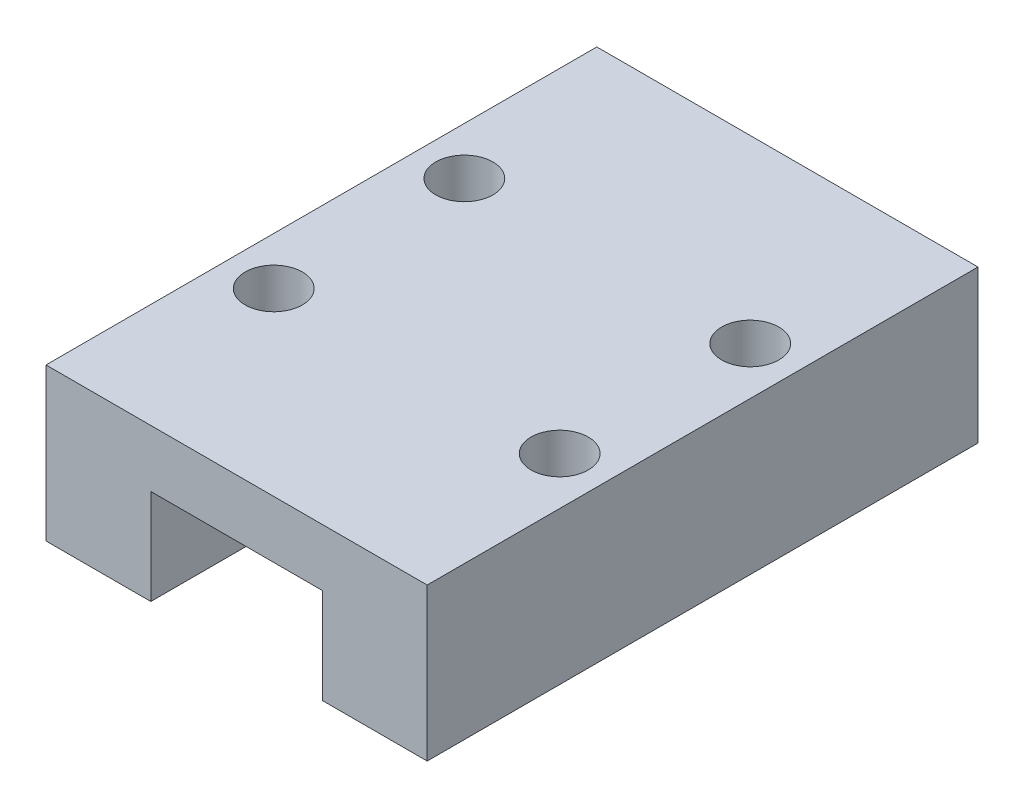
ISO-10303-21;
HEADER;
FILE_DESCRIPTION(('STEP AP214'),'2;1');
FILE_NAME('part.step','',(''),(''),'','','');
FILE_SCHEMA(('AUTOMOTIVE_DESIGN { 1 0 10303 214 1 1 1 1 }'));
ENDSEC;
DATA;
#1=APPLICATION_CONTEXT('core data for automotive mechanical design processes');
#2=APPLICATION_PROTOCOL_DEFINITION('international standard','automotive_design',2000,#1);
#3=PRODUCT_CONTEXT('',#1,'mechanical');
#4=PRODUCT('Part','Part','',(#3));
#5=PRODUCT_RELATED_PRODUCT_CATEGORY('part','',(#4));
#6=PRODUCT_DEFINITION_FORMATION('','',#4);
#7=PRODUCT_DEFINITION_CONTEXT('part definition',#1,'design');
#8=PRODUCT_DEFINITION('design','',#6,#7);
#9=PRODUCT_DEFINITION_SHAPE('','',#8);
#10=(LENGTH_UNIT() NAMED_UNIT(*) SI_UNIT(.MILLI.,.METRE.));
#11=(NAMED_UNIT(*) PLANE_ANGLE_UNIT() SI_UNIT($,.RADIAN.));
#12=(NAMED_UNIT(*) SI_UNIT($,.STERADIAN.) SOLID_ANGLE_UNIT());
#13=UNCERTAINTY_MEASURE_WITH_UNIT(LENGTH_MEASURE(1.E-05),#10,'distance_accuracy_value','');
#14=(GEOMETRIC_REPRESENTATION_CONTEXT(3) GLOBAL_UNCERTAINTY_ASSIGNED_CONTEXT((#13)) GLOBAL_UNIT_ASSIGNED_CONTEXT((#10,
#11,#12)) REPRESENTATION_CONTEXT('',''));
#15=CARTESIAN_POINT('',(0.,0.,0.));
#16=DIRECTION('',(0.,0.,1.));
#17=DIRECTION('',(1.,0.,0.));
#18=AXIS2_PLACEMENT_3D('',#15,#16,#17);
#19=CARTESIAN_POINT('',(0.,0.,28.9));
#20=DIRECTION('',(-1.,0.,0.));
#21=DIRECTION('',(0.,-1.,0.));
#22=AXIS2_PLACEMENT_3D('',#19,#20,#21);
#23=PLANE('',#22);
#24=DIRECTION('',(0.,1.,0.));
#25=VECTOR('',#24,1.);
#26=CARTESIAN_POINT('',(0.,0.,0.));
#27=LINE('',#26,#25);
#28=CARTESIAN_POINT('',(0.,0.,0.));
#29=VERTEX_POINT('',#28);
#30=CARTESIAN_POINT('',(0.,8.,0.));
#31=VERTEX_POINT('',#30);
#32=EDGE_CURVE('E130',#29,#31,#27,.T.);
#33=ORIENTED_EDGE('',*,*,#32,.T.);
#34=DIRECTION('',(0.,0.,-1.));
#35=VECTOR('',#34,1.);
#36=CARTESIAN_POINT('',(0.,8.,28.9));
#37=LINE('',#36,#35);
#38=CARTESIAN_POINT('',(0.,8.,28.9));
#39=VERTEX_POINT('',#38);
#40=EDGE_CURVE('E11',#39,#31,#37,.T.);
#41=ORIENTED_EDGE('',*,*,#40,.F.);
#42=DIRECTION('',(0.,1.,0.));
#43=VECTOR('',#42,1.);
#44=CARTESIAN_POINT('',(0.,0.,28.9));
#45=LINE('',#44,#43);
#46=CARTESIAN_POINT('',(0.,0.,28.9));
#47=VERTEX_POINT('',#46);
#48=EDGE_CURVE('E145',#47,#39,#45,.T.);
#49=ORIENTED_EDGE('',*,*,#48,.F.);
#50=DIRECTION('',(0.,0.,-1.));
#51=VECTOR('',#50,1.);
#52=CARTESIAN_POINT('',(0.,0.,28.9));
#53=LINE('',#52,#51);
#54=EDGE_CURVE('E126',#47,#29,#53,.T.);
#55=ORIENTED_EDGE('',*,*,#54,.T.);
#56=EDGE_LOOP('',(#33,#41,#49,#55));
#57=FACE_BOUND('',#56,.T.);
#58=ADVANCED_FACE('F34',(#57),#23,.F.);
#59=CARTESIAN_POINT('',(0.,8.,28.9));
#60=DIRECTION('',(0.,-1.,0.));
#61=DIRECTION('',(1.,0.,0.));
#62=AXIS2_PLACEMENT_3D('',#59,#60,#61);
#63=PLANE('',#62);
#64=CARTESIAN_POINT('',(-17.5,8.,19.45));
#65=DIRECTION('',(0.,1.,0.));
#66=DIRECTION('',(1.,0.,0.));
#67=AXIS2_PLACEMENT_3D('',#64,#65,#66);
#68=CIRCLE('',#67,1.5);
#69=CARTESIAN_POINT('',(-16.,8.,19.45));
#70=VERTEX_POINT('',#69);
#71=EDGE_CURVE('E196',#70,#70,#68,.T.);
#72=ORIENTED_EDGE('',*,*,#71,.F.);
#73=EDGE_LOOP('',(#72));
#74=FACE_BOUND('',#73,.T.);
#75=CARTESIAN_POINT('',(-2.5,8.,19.45));
#76=DIRECTION('',(0.,1.,0.));
#77=DIRECTION('',(-1.,0.,0.));
#78=AXIS2_PLACEMENT_3D('',#75,#76,#77);
#79=CIRCLE('',#78,1.5);
#80=CARTESIAN_POINT('',(-4.,8.,19.45));
#81=VERTEX_POINT('',#80);
#82=EDGE_CURVE('E190',#81,#81,#79,.T.);
#83=ORIENTED_EDGE('',*,*,#82,.F.);
#84=EDGE_LOOP('',(#83));
#85=FACE_BOUND('',#84,.T.);
#86=CARTESIAN_POINT('',(-2.5,8.,9.45));
#87=DIRECTION('',(0.,1.,0.));
#88=DIRECTION('',(1.,0.,0.));
#89=AXIS2_PLACEMENT_3D('',#86,#87,#88);
#90=CIRCLE('',#89,1.5);
#91=CARTESIAN_POINT('',(-1.,8.,9.45));
#92=VERTEX_POINT('',#91);
#93=EDGE_CURVE('E184',#92,#92,#90,.T.);
#94=ORIENTED_EDGE('',*,*,#93,.F.);
#95=EDGE_LOOP('',(#94));
#96=FACE_BOUND('',#95,.T.);
#97=CARTESIAN_POINT('',(-17.5,8.,9.45));
#98=DIRECTION('',(0.,1.,0.));
#99=DIRECTION('',(-1.,0.,0.));
#100=AXIS2_PLACEMENT_3D('',#97,#98,#99);
#101=CIRCLE('',#100,1.5);
#102=CARTESIAN_POINT('',(-19.,8.,9.45));
#103=VERTEX_POINT('',#102);
#104=EDGE_CURVE('E178',#103,#103,#101,.T.);
#105=ORIENTED_EDGE('',*,*,#104,.F.);
#106=EDGE_LOOP('',(#105));
#107=FACE_BOUND('',#106,.T.);
#108=DIRECTION('',(-1.,0.,0.));
#109=VECTOR('',#108,1.);
#110=CARTESIAN_POINT('',(0.,8.,0.));
#111=LINE('',#110,#109);
#112=CARTESIAN_POINT('',(-20.,8.,0.));
#113=VERTEX_POINT('',#112);
#114=EDGE_CURVE('E133',#31,#113,#111,.T.);
#115=ORIENTED_EDGE('',*,*,#114,.T.);
#116=DIRECTION('',(0.,0.,-1.));
#117=VECTOR('',#116,1.);
#118=CARTESIAN_POINT('',(-20.,8.,28.9));
#119=LINE('',#118,#117);
#120=CARTESIAN_POINT('',(-20.,8.,28.9));
#121=VERTEX_POINT('',#120);
#122=EDGE_CURVE('E42',#121,#113,#119,.T.);
#123=ORIENTED_EDGE('',*,*,#122,.F.);
#124=DIRECTION('',(-1.,0.,0.));
#125=VECTOR('',#124,1.);
#126=CARTESIAN_POINT('',(0.,8.,28.9));
#127=LINE('',#126,#125);
#128=EDGE_CURVE('E93',#39,#121,#127,.T.);
#129=ORIENTED_EDGE('',*,*,#128,.F.);
#130=ORIENTED_EDGE('',*,*,#40,.T.);
#131=EDGE_LOOP('',(#115,#123,#129,#130));
#132=FACE_BOUND('',#131,.T.);
#133=ADVANCED_FACE('F211',(#74,#85,#96,#107,#132),#63,.F.);
#134=CARTESIAN_POINT('',(-20.,0.,28.9));
#135=DIRECTION('',(1.,0.,0.));
#136=DIRECTION('',(0.,0.,-1.));
#137=AXIS2_PLACEMENT_3D('',#134,#135,#136);
#138=PLANE('',#137);
#139=DIRECTION('',(0.,-1.,0.));
#140=VECTOR('',#139,1.);
#141=CARTESIAN_POINT('',(-20.,0.,0.));
#142=LINE('',#141,#140);
#143=CARTESIAN_POINT('',(-20.,0.,0.));
#144=VERTEX_POINT('',#143);
#145=EDGE_CURVE('E136',#113,#144,#142,.T.);
#146=ORIENTED_EDGE('',*,*,#145,.T.);
#147=DIRECTION('',(0.,0.,-1.));
#148=VECTOR('',#147,1.);
#149=CARTESIAN_POINT('',(-20.,0.,28.9));
#150=LINE('',#149,#148);
#151=CARTESIAN_POINT('',(-20.,0.,28.9));
#152=VERTEX_POINT('',#151);
#153=EDGE_CURVE('E152',#152,#144,#150,.T.);
#154=ORIENTED_EDGE('',*,*,#153,.F.);
#155=DIRECTION('',(0.,-1.,0.));
#156=VECTOR('',#155,1.);
#157=CARTESIAN_POINT('',(-20.,0.,28.9));
#158=LINE('',#157,#156);
#159=EDGE_CURVE('E160',#121,#152,#158,.T.);
#160=ORIENTED_EDGE('',*,*,#159,.F.);
#161=ORIENTED_EDGE('',*,*,#122,.T.);
#162=EDGE_LOOP('',(#146,#154,#160,#161));
#163=FACE_BOUND('',#162,.T.);
#164=ADVANCED_FACE('F158',(#163),#138,.F.);
#165=CARTESIAN_POINT('',(-14.5,0.,28.9));
#166=DIRECTION('',(0.,1.,0.));
#167=DIRECTION('',(-1.,0.,0.));
#168=AXIS2_PLACEMENT_3D('',#165,#166,#167);
#169=PLANE('',#168);
#170=DIRECTION('',(1.,0.,0.));
#171=VECTOR('',#170,1.);
#172=CARTESIAN_POINT('',(-14.5,0.,0.));
#173=LINE('',#172,#171);
#174=CARTESIAN_POINT('',(-14.5,0.,0.));
#175=VERTEX_POINT('',#174);
#176=EDGE_CURVE('E138',#144,#175,#173,.T.);
#177=ORIENTED_EDGE('',*,*,#176,.T.);
#178=DIRECTION('',(0.,0.,-1.));
#179=VECTOR('',#178,1.);
#180=CARTESIAN_POINT('',(-14.5,0.,28.9));
#181=LINE('',#180,#179);
#182=CARTESIAN_POINT('',(-14.5,0.,28.9));
#183=VERTEX_POINT('',#182);
#184=EDGE_CURVE('E149',#183,#175,#181,.T.);
#185=ORIENTED_EDGE('',*,*,#184,.F.);
#186=DIRECTION('',(1.,0.,0.));
#187=VECTOR('',#186,1.);
#188=CARTESIAN_POINT('',(-14.5,0.,28.9));
#189=LINE('',#188,#187);
#190=EDGE_CURVE('E172',#152,#183,#189,.T.);
#191=ORIENTED_EDGE('',*,*,#190,.F.);
#192=ORIENTED_EDGE('',*,*,#153,.T.);
#193=EDGE_LOOP('',(#177,#185,#191,#192));
#194=FACE_BOUND('',#193,.T.);
#195=ADVANCED_FACE('F168',(#194),#169,.F.);
#196=CARTESIAN_POINT('',(-14.5,0.,28.9));
#197=DIRECTION('',(-1.,0.,0.));
#198=DIRECTION('',(0.,0.,1.));
#199=AXIS2_PLACEMENT_3D('',#196,#197,#198);
#200=PLANE('',#199);
#201=DIRECTION('',(0.,1.,0.));
#202=VECTOR('',#201,1.);
#203=CARTESIAN_POINT('',(-14.5,0.,0.));
#204=LINE('',#203,#202);
#205=CARTESIAN_POINT('',(-14.5,5.,0.));
#206=VERTEX_POINT('',#205);
#207=EDGE_CURVE('E140',#175,#206,#204,.T.);
#208=ORIENTED_EDGE('',*,*,#207,.T.);
#209=DIRECTION('',(0.,0.,-1.));
#210=VECTOR('',#209,1.);
#211=CARTESIAN_POINT('',(-14.5,5.,28.9));
#212=LINE('',#211,#210);
#213=CARTESIAN_POINT('',(-14.5,5.,28.9));
#214=VERTEX_POINT('',#213);
#215=EDGE_CURVE('E121',#214,#206,#212,.T.);
#216=ORIENTED_EDGE('',*,*,#215,.F.);
#217=DIRECTION('',(0.,1.,0.));
#218=VECTOR('',#217,1.);
#219=CARTESIAN_POINT('',(-14.5,0.,28.9));
#220=LINE('',#219,#218);
#221=EDGE_CURVE('E112',#183,#214,#220,.T.);
#222=ORIENTED_EDGE('',*,*,#221,.F.);
#223=ORIENTED_EDGE('',*,*,#184,.T.);
#224=EDGE_LOOP('',(#208,#216,#222,#223));
#225=FACE_BOUND('',#224,.T.);
#226=ADVANCED_FACE('F171',(#225),#200,.F.);
#227=CARTESIAN_POINT('',(-14.5,5.,28.9));
#228=DIRECTION('',(0.,1.,0.));
#229=DIRECTION('',(-1.,0.,0.));
#230=AXIS2_PLACEMENT_3D('',#227,#228,#229);
#231=PLANE('',#230);
#232=DIRECTION('',(1.,0.,0.));
#233=VECTOR('',#232,1.);
#234=CARTESIAN_POINT('',(-14.5,5.,0.));
#235=LINE('',#234,#233);
#236=CARTESIAN_POINT('',(-5.5,5.,0.));
#237=VERTEX_POINT('',#236);
#238=EDGE_CURVE('E120',#206,#237,#235,.T.);
#239=ORIENTED_EDGE('',*,*,#238,.T.);
#240=DIRECTION('',(0.,0.,-1.));
#241=VECTOR('',#240,1.);
#242=CARTESIAN_POINT('',(-5.5,5.,28.9));
#243=LINE('',#242,#241);
#244=CARTESIAN_POINT('',(-5.5,5.,28.9));
#245=VERTEX_POINT('',#244);
#246=EDGE_CURVE('E117',#245,#237,#243,.T.);
#247=ORIENTED_EDGE('',*,*,#246,.F.);
#248=DIRECTION('',(1.,0.,0.));
#249=VECTOR('',#248,1.);
#250=CARTESIAN_POINT('',(-14.5,5.,28.9));
#251=LINE('',#250,#249);
#252=EDGE_CURVE('E106',#214,#245,#251,.T.);
#253=ORIENTED_EDGE('',*,*,#252,.F.);
#254=ORIENTED_EDGE('',*,*,#215,.T.);
#255=EDGE_LOOP('',(#239,#247,#253,#254));
#256=FACE_BOUND('',#255,.T.);
#257=ADVANCED_FACE('F118',(#256),#231,.F.);
#258=CARTESIAN_POINT('',(-5.5,0.,28.9));
#259=DIRECTION('',(1.,0.,0.));
#260=DIRECTION('',(0.,1.,0.));
#261=AXIS2_PLACEMENT_3D('',#258,#259,#260);
#262=PLANE('',#261);
#263=DIRECTION('',(0.,-1.,0.));
#264=VECTOR('',#263,1.);
#265=CARTESIAN_POINT('',(-5.5,0.,0.));
#266=LINE('',#265,#264);
#267=CARTESIAN_POINT('',(-5.5,0.,0.));
#268=VERTEX_POINT('',#267);
#269=EDGE_CURVE('E79',#237,#268,#266,.T.);
#270=ORIENTED_EDGE('',*,*,#269,.T.);
#271=DIRECTION('',(0.,0.,-1.));
#272=VECTOR('',#271,1.);
#273=CARTESIAN_POINT('',(-5.5,0.,28.9));
#274=LINE('',#273,#272);
#275=CARTESIAN_POINT('',(-5.5,0.,28.9));
#276=VERTEX_POINT('',#275);
#277=EDGE_CURVE('E122',#276,#268,#274,.T.);
#278=ORIENTED_EDGE('',*,*,#277,.F.);
#279=DIRECTION('',(0.,-1.,0.));
#280=VECTOR('',#279,1.);
#281=CARTESIAN_POINT('',(-5.5,0.,28.9));
#282=LINE('',#281,#280);
#283=EDGE_CURVE('E110',#245,#276,#282,.T.);
#284=ORIENTED_EDGE('',*,*,#283,.F.);
#285=ORIENTED_EDGE('',*,*,#246,.T.);
#286=EDGE_LOOP('',(#270,#278,#284,#285));
#287=FACE_BOUND('',#286,.T.);
#288=ADVANCED_FACE('F124',(#287),#262,.F.);
#289=CARTESIAN_POINT('',(0.,0.,28.9));
#290=DIRECTION('',(0.,1.,0.));
#291=DIRECTION('',(-1.,0.,0.));
#292=AXIS2_PLACEMENT_3D('',#289,#290,#291);
#293=PLANE('',#292);
#294=DIRECTION('',(1.,0.,0.));
#295=VECTOR('',#294,1.);
#296=CARTESIAN_POINT('',(0.,0.,0.));
#297=LINE('',#296,#295);
#298=EDGE_CURVE('E85',#268,#29,#297,.T.);
#299=ORIENTED_EDGE('',*,*,#298,.T.);
#300=ORIENTED_EDGE('',*,*,#54,.F.);
#301=DIRECTION('',(1.,0.,0.));
#302=VECTOR('',#301,1.);
#303=CARTESIAN_POINT('',(0.,0.,28.9));
#304=LINE('',#303,#302);
#305=EDGE_CURVE('E50',#276,#47,#304,.T.);
#306=ORIENTED_EDGE('',*,*,#305,.F.);
#307=ORIENTED_EDGE('',*,*,#277,.T.);
#308=EDGE_LOOP('',(#299,#300,#306,#307));
#309=FACE_BOUND('',#308,.T.);
#310=ADVANCED_FACE('F222',(#309),#293,.F.);
#311=CARTESIAN_POINT('',(0.,0.,28.9));
#312=DIRECTION('',(0.,0.,1.));
#313=DIRECTION('',(1.,0.,0.));
#314=AXIS2_PLACEMENT_3D('',#311,#312,#313);
#315=PLANE('',#314);
#316=ORIENTED_EDGE('',*,*,#48,.T.);
#317=ORIENTED_EDGE('',*,*,#128,.T.);
#318=ORIENTED_EDGE('',*,*,#159,.T.);
#319=ORIENTED_EDGE('',*,*,#190,.T.);
#320=ORIENTED_EDGE('',*,*,#221,.T.);
#321=ORIENTED_EDGE('',*,*,#252,.T.);
#322=ORIENTED_EDGE('',*,*,#283,.T.);
#323=ORIENTED_EDGE('',*,*,#305,.T.);
#324=EDGE_LOOP('',(#316,#317,#318,#319,#320,#321,#322,#323));
#325=FACE_BOUND('',#324,.T.);
#326=ADVANCED_FACE('F108',(#325),#315,.T.);
#327=CARTESIAN_POINT('',(0.,0.,0.));
#328=DIRECTION('',(0.,0.,1.));
#329=DIRECTION('',(1.,0.,0.));
#330=AXIS2_PLACEMENT_3D('',#327,#328,#329);
#331=PLANE('',#330);
#332=ORIENTED_EDGE('',*,*,#32,.F.);
#333=ORIENTED_EDGE('',*,*,#298,.F.);
#334=ORIENTED_EDGE('',*,*,#269,.F.);
#335=ORIENTED_EDGE('',*,*,#238,.F.);
#336=ORIENTED_EDGE('',*,*,#207,.F.);
#337=ORIENTED_EDGE('',*,*,#176,.F.);
#338=ORIENTED_EDGE('',*,*,#145,.F.);
#339=ORIENTED_EDGE('',*,*,#114,.F.);
#340=EDGE_LOOP('',(#332,#333,#334,#335,#336,#337,#338,#339));
#341=FACE_BOUND('',#340,.T.);
#342=ADVANCED_FACE('F164',(#341),#331,.F.);
#343=CARTESIAN_POINT('',(-17.5,3.,9.45));
#344=DIRECTION('',(0.,1.,0.));
#345=DIRECTION('',(-1.,0.,0.));
#346=AXIS2_PLACEMENT_3D('',#343,#344,#345);
#347=CYLINDRICAL_SURFACE('',#346,1.5);
#348=CARTESIAN_POINT('',(-17.5,3.,9.45));
#349=DIRECTION('',(0.,1.,0.));
#350=DIRECTION('',(-1.,0.,0.));
#351=AXIS2_PLACEMENT_3D('',#348,#349,#350);
#352=CIRCLE('',#351,1.5);
#353=CARTESIAN_POINT('',(-19.,3.,9.45));
#354=VERTEX_POINT('',#353);
#355=EDGE_CURVE('E134',#354,#354,#352,.T.);
#356=ORIENTED_EDGE('',*,*,#355,.F.);
#357=EDGE_LOOP('',(#356));
#358=FACE_BOUND('',#357,.T.);
#359=ORIENTED_EDGE('',*,*,#104,.T.);
#360=EDGE_LOOP('',(#359));
#361=FACE_BOUND('',#360,.T.);
#362=ADVANCED_FACE('F286',(#358,#361),#347,.F.);
#363=CARTESIAN_POINT('',(-17.5,3.,9.45));
#364=DIRECTION('',(0.,1.,0.));
#365=DIRECTION('',(-1.,0.,0.));
#366=AXIS2_PLACEMENT_3D('',#363,#364,#365);
#367=PLANE('',#366);
#368=ORIENTED_EDGE('',*,*,#355,.T.);
#369=EDGE_LOOP('',(#368));
#370=FACE_BOUND('',#369,.T.);
#371=ADVANCED_FACE('F294',(#370),#367,.T.);
#372=CARTESIAN_POINT('',(-2.5,3.,9.45));
#373=DIRECTION('',(0.,1.,0.));
#374=DIRECTION('',(-1.,0.,0.));
#375=AXIS2_PLACEMENT_3D('',#372,#373,#374);
#376=CYLINDRICAL_SURFACE('',#375,1.5);
#377=CARTESIAN_POINT('',(-2.5,3.,9.45));
#378=DIRECTION('',(0.,1.,0.));
#379=DIRECTION('',(1.,0.,0.));
#380=AXIS2_PLACEMENT_3D('',#377,#378,#379);
#381=CIRCLE('',#380,1.5);
#382=CARTESIAN_POINT('',(-1.,3.,9.45));
#383=VERTEX_POINT('',#382);
#384=EDGE_CURVE('E181',#383,#383,#381,.T.);
#385=ORIENTED_EDGE('',*,*,#384,.F.);
#386=EDGE_LOOP('',(#385));
#387=FACE_BOUND('',#386,.T.);
#388=ORIENTED_EDGE('',*,*,#93,.T.);
#389=EDGE_LOOP('',(#388));
#390=FACE_BOUND('',#389,.T.);
#391=ADVANCED_FACE('F301',(#387,#390),#376,.F.);
#392=CARTESIAN_POINT('',(-2.5,3.,9.45));
#393=DIRECTION('',(0.,-1.,0.));
#394=DIRECTION('',(1.,0.,0.));
#395=AXIS2_PLACEMENT_3D('',#392,#393,#394);
#396=PLANE('',#395);
#397=ORIENTED_EDGE('',*,*,#384,.T.);
#398=EDGE_LOOP('',(#397));
#399=FACE_BOUND('',#398,.T.);
#400=ADVANCED_FACE('F309',(#399),#396,.F.);
#401=CARTESIAN_POINT('',(-2.5,3.,19.45));
#402=DIRECTION('',(0.,1.,0.));
#403=DIRECTION('',(-1.,0.,0.));
#404=AXIS2_PLACEMENT_3D('',#401,#402,#403);
#405=CYLINDRICAL_SURFACE('',#404,1.5);
#406=CARTESIAN_POINT('',(-2.5,3.,19.45));
#407=DIRECTION('',(0.,1.,0.));
#408=DIRECTION('',(-1.,0.,0.));
#409=AXIS2_PLACEMENT_3D('',#406,#407,#408);
#410=CIRCLE('',#409,1.5);
#411=CARTESIAN_POINT('',(-4.,3.,19.45));
#412=VERTEX_POINT('',#411);
#413=EDGE_CURVE('E187',#412,#412,#410,.T.);
#414=ORIENTED_EDGE('',*,*,#413,.F.);
#415=EDGE_LOOP('',(#414));
#416=FACE_BOUND('',#415,.T.);
#417=ORIENTED_EDGE('',*,*,#82,.T.);
#418=EDGE_LOOP('',(#417));
#419=FACE_BOUND('',#418,.T.);
#420=ADVANCED_FACE('F317',(#416,#419),#405,.F.);
#421=CARTESIAN_POINT('',(-2.5,3.,19.45));
#422=DIRECTION('',(0.,1.,0.));
#423=DIRECTION('',(-1.,0.,0.));
#424=AXIS2_PLACEMENT_3D('',#421,#422,#423);
#425=PLANE('',#424);
#426=ORIENTED_EDGE('',*,*,#413,.T.);
#427=EDGE_LOOP('',(#426));
#428=FACE_BOUND('',#427,.T.);
#429=ADVANCED_FACE('F207',(#428),#425,.T.);
#430=CARTESIAN_POINT('',(-17.5,3.,19.45));
#431=DIRECTION('',(0.,1.,0.));
#432=DIRECTION('',(-1.,0.,0.));
#433=AXIS2_PLACEMENT_3D('',#430,#431,#432);
#434=CYLINDRICAL_SURFACE('',#433,1.5);
#435=CARTESIAN_POINT('',(-17.5,3.,19.45));
#436=DIRECTION('',(0.,1.,0.));
#437=DIRECTION('',(1.,0.,0.));
#438=AXIS2_PLACEMENT_3D('',#435,#436,#437);
#439=CIRCLE('',#438,1.5);
#440=CARTESIAN_POINT('',(-16.,3.,19.45));
#441=VERTEX_POINT('',#440);
#442=EDGE_CURVE('E193',#441,#441,#439,.T.);
#443=ORIENTED_EDGE('',*,*,#442,.F.);
#444=EDGE_LOOP('',(#443));
#445=FACE_BOUND('',#444,.T.);
#446=ORIENTED_EDGE('',*,*,#71,.T.);
#447=EDGE_LOOP('',(#446));
#448=FACE_BOUND('',#447,.T.);
#449=ADVANCED_FACE('F204',(#445,#448),#434,.F.);
#450=CARTESIAN_POINT('',(-17.5,3.,19.45));
#451=DIRECTION('',(0.,-1.,0.));
#452=DIRECTION('',(1.,0.,0.));
#453=AXIS2_PLACEMENT_3D('',#450,#451,#452);
#454=PLANE('',#453);
#455=ORIENTED_EDGE('',*,*,#442,.T.);
#456=EDGE_LOOP('',(#455));
#457=FACE_BOUND('',#456,.T.);
#458=ADVANCED_FACE('F202',(#457),#454,.F.);
#459=CLOSED_SHELL('',(#58,#133,#164,#195,#226,#257,#288,#310,#326,#342,#362,#371,#391,#400,#420,
#429,#449,#458));
#460=MANIFOLD_SOLID_BREP('B2',#459);
#461=ADVANCED_BREP_SHAPE_REPRESENTATION('',(#18,#460),#14);
#462=SHAPE_DEFINITION_REPRESENTATION(#9,#461);
ENDSEC;
END-ISO-10303-21;
